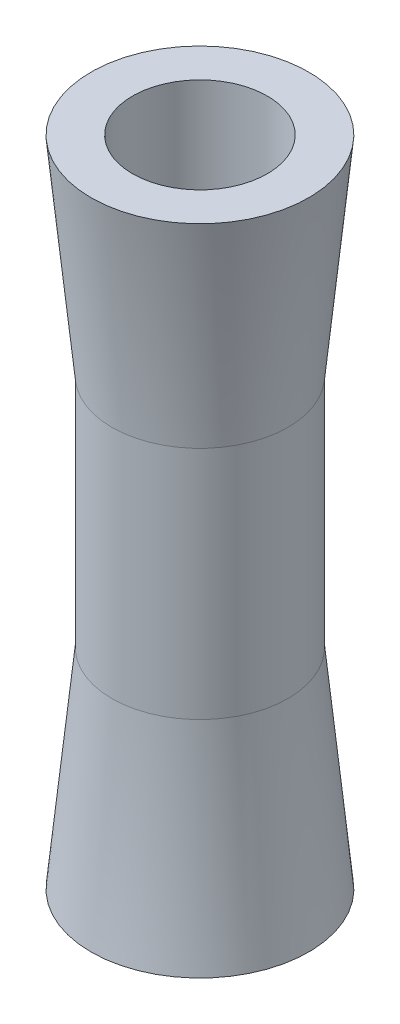
ISO-10303-21;
HEADER;
FILE_DESCRIPTION(('STEP AP214'),'2;1');
FILE_NAME('part.step','',(''),(''),'','','');
FILE_SCHEMA(('AUTOMOTIVE_DESIGN { 1 0 10303 214 1 1 1 1 }'));
ENDSEC;
DATA;
#1=APPLICATION_CONTEXT('core data for automotive mechanical design processes');
#2=APPLICATION_PROTOCOL_DEFINITION('international standard','automotive_design',2000,#1);
#3=PRODUCT_CONTEXT('',#1,'mechanical');
#4=PRODUCT('Part','Part','',(#3));
#5=PRODUCT_RELATED_PRODUCT_CATEGORY('part','',(#4));
#6=PRODUCT_DEFINITION_FORMATION('','',#4);
#7=PRODUCT_DEFINITION_CONTEXT('part definition',#1,'design');
#8=PRODUCT_DEFINITION('design','',#6,#7);
#9=PRODUCT_DEFINITION_SHAPE('','',#8);
#10=(LENGTH_UNIT() NAMED_UNIT(*) SI_UNIT(.MILLI.,.METRE.));
#11=(NAMED_UNIT(*) PLANE_ANGLE_UNIT() SI_UNIT($,.RADIAN.));
#12=(NAMED_UNIT(*) SI_UNIT($,.STERADIAN.) SOLID_ANGLE_UNIT());
#13=UNCERTAINTY_MEASURE_WITH_UNIT(LENGTH_MEASURE(1.E-05),#10,'distance_accuracy_value','');
#14=(GEOMETRIC_REPRESENTATION_CONTEXT(3) GLOBAL_UNCERTAINTY_ASSIGNED_CONTEXT((#13)) GLOBAL_UNIT_ASSIGNED_CONTEXT((#10,
#11,#12)) REPRESENTATION_CONTEXT('',''));
#15=CARTESIAN_POINT('',(0.,0.,0.));
#16=DIRECTION('',(0.,0.,1.));
#17=DIRECTION('',(1.,0.,0.));
#18=AXIS2_PLACEMENT_3D('',#15,#16,#17);
#19=CARTESIAN_POINT('',(0.,63.,0.));
#20=DIRECTION('',(0.,1.,0.));
#21=DIRECTION('',(0.,0.,1.));
#22=AXIS2_PLACEMENT_3D('',#19,#20,#21);
#23=PLANE('',#22);
#24=CARTESIAN_POINT('',(0.,63.,0.));
#25=DIRECTION('',(0.,1.,0.));
#26=DIRECTION('',(0.,0.,1.));
#27=AXIS2_PLACEMENT_3D('',#24,#25,#26);
#28=CIRCLE('',#27,6.5);
#29=CARTESIAN_POINT('',(0.,63.,6.5));
#30=VERTEX_POINT('',#29);
#31=EDGE_CURVE('E42',#30,#30,#28,.T.);
#32=ORIENTED_EDGE('',*,*,#31,.F.);
#33=EDGE_LOOP('',(#32));
#34=FACE_BOUND('',#33,.T.);
#35=CARTESIAN_POINT('',(0.,63.0000000000001,0.));
#36=DIRECTION('',(0.,1.,0.));
#37=DIRECTION('',(0.,0.,1.));
#38=AXIS2_PLACEMENT_3D('',#35,#36,#37);
#39=CIRCLE('',#38,10.5);
#40=CARTESIAN_POINT('',(0.,63.0000000000001,10.5));
#41=VERTEX_POINT('',#40);
#42=EDGE_CURVE('E50',#41,#41,#39,.T.);
#43=ORIENTED_EDGE('',*,*,#42,.T.);
#44=EDGE_LOOP('',(#43));
#45=FACE_BOUND('',#44,.T.);
#46=ADVANCED_FACE('F31',(#34,#45),#23,.T.);
#47=CARTESIAN_POINT('',(0.,0.,0.));
#48=DIRECTION('',(0.,1.,0.));
#49=DIRECTION('',(0.,0.,1.));
#50=AXIS2_PLACEMENT_3D('',#47,#48,#49);
#51=PLANE('',#50);
#52=CARTESIAN_POINT('',(0.,0.,0.));
#53=DIRECTION('',(0.,1.,0.));
#54=DIRECTION('',(0.,0.,1.));
#55=AXIS2_PLACEMENT_3D('',#52,#53,#54);
#56=CIRCLE('',#55,6.5);
#57=CARTESIAN_POINT('',(0.,0.,6.5));
#58=VERTEX_POINT('',#57);
#59=EDGE_CURVE('E46',#58,#58,#56,.T.);
#60=ORIENTED_EDGE('',*,*,#59,.T.);
#61=EDGE_LOOP('',(#60));
#62=FACE_BOUND('',#61,.T.);
#63=CARTESIAN_POINT('',(0.,0.,0.));
#64=DIRECTION('',(0.,1.,0.));
#65=DIRECTION('',(0.,0.,1.));
#66=AXIS2_PLACEMENT_3D('',#63,#64,#65);
#67=CIRCLE('',#66,10.5);
#68=CARTESIAN_POINT('',(0.,0.,10.5));
#69=VERTEX_POINT('',#68);
#70=EDGE_CURVE('E54',#69,#69,#67,.T.);
#71=ORIENTED_EDGE('',*,*,#70,.F.);
#72=EDGE_LOOP('',(#71));
#73=FACE_BOUND('',#72,.T.);
#74=ADVANCED_FACE('F60',(#62,#73),#51,.F.);
#75=CARTESIAN_POINT('',(0.,63.,0.));
#76=DIRECTION('',(0.,-1.,0.));
#77=DIRECTION('',(0.,0.,-1.));
#78=AXIS2_PLACEMENT_3D('',#75,#76,#77);
#79=CYLINDRICAL_SURFACE('',#78,6.5);
#80=ORIENTED_EDGE('',*,*,#31,.T.);
#81=EDGE_LOOP('',(#80));
#82=FACE_BOUND('',#81,.T.);
#83=ORIENTED_EDGE('',*,*,#59,.F.);
#84=EDGE_LOOP('',(#83));
#85=FACE_BOUND('',#84,.T.);
#86=ADVANCED_FACE('F62',(#82,#85),#79,.F.);
#87=CARTESIAN_POINT('',(0.,31.5,0.));
#88=DIRECTION('',(0.,1.,0.));
#89=DIRECTION('',(0.,0.,1.));
#90=AXIS2_PLACEMENT_3D('',#87,#88,#89);
#91=TOROIDAL_SURFACE('',#90,225.494449149451,217.289813762808);
#92=ORIENTED_EDGE('',*,*,#70,.T.);
#93=EDGE_LOOP('',(#92));
#94=FACE_BOUND('',#93,.T.);
#95=CARTESIAN_POINT('',(0.,20.1742680853647,0.));
#96=DIRECTION('',(0.,1.,0.));
#97=DIRECTION('',(0.,0.,1.));
#98=AXIS2_PLACEMENT_3D('',#95,#96,#97);
#99=CIRCLE('',#98,8.5);
#100=CARTESIAN_POINT('',(0.,20.1742680853647,8.5));
#101=VERTEX_POINT('',#100);
#102=EDGE_CURVE('E38',#101,#101,#99,.F.);
#103=ORIENTED_EDGE('',*,*,#102,.T.);
#104=EDGE_LOOP('',(#103));
#105=FACE_BOUND('',#104,.T.);
#106=ADVANCED_FACE('F58',(#94,#105),#91,.F.);
#107=CARTESIAN_POINT('',(0.,63.,0.));
#108=DIRECTION('',(0.,-1.,0.));
#109=DIRECTION('',(0.,0.,-1.));
#110=AXIS2_PLACEMENT_3D('',#107,#108,#109);
#111=CYLINDRICAL_SURFACE('',#110,8.5);
#112=ORIENTED_EDGE('',*,*,#102,.F.);
#113=EDGE_LOOP('',(#112));
#114=FACE_BOUND('',#113,.T.);
#115=CARTESIAN_POINT('',(0.,42.8257319146354,0.));
#116=DIRECTION('',(0.,-1.,0.));
#117=DIRECTION('',(0.,0.,-1.));
#118=AXIS2_PLACEMENT_3D('',#115,#116,#117);
#119=CIRCLE('',#118,8.5);
#120=CARTESIAN_POINT('',(0.,42.8257319146354,-8.5));
#121=VERTEX_POINT('',#120);
#122=EDGE_CURVE('E10',#121,#121,#119,.F.);
#123=ORIENTED_EDGE('',*,*,#122,.F.);
#124=EDGE_LOOP('',(#123));
#125=FACE_BOUND('',#124,.T.);
#126=ADVANCED_FACE('F33',(#114,#125),#111,.T.);
#127=ORIENTED_EDGE('',*,*,#42,.F.);
#128=EDGE_LOOP('',(#127));
#129=FACE_BOUND('',#128,.T.);
#130=ORIENTED_EDGE('',*,*,#122,.T.);
#131=EDGE_LOOP('',(#130));
#132=FACE_BOUND('',#131,.T.);
#133=ADVANCED_FACE('F73',(#129,#132),#91,.F.);
#134=CLOSED_SHELL('',(#46,#74,#86,#106,#126,#133));
#135=MANIFOLD_SOLID_BREP('B2',#134);
#136=ADVANCED_BREP_SHAPE_REPRESENTATION('',(#18,#135),#14);
#137=SHAPE_DEFINITION_REPRESENTATION(#9,#136);
ENDSEC;
END-ISO-10303-21;
